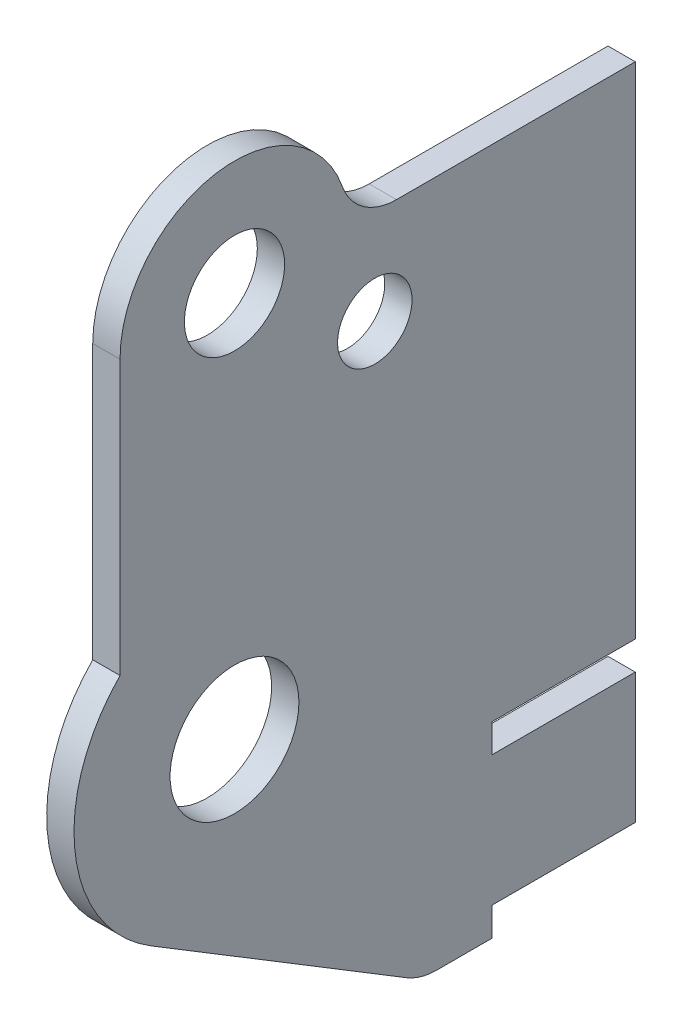
ISO-10303-21;
HEADER;
FILE_DESCRIPTION(('STEP AP214'),'2;1');
FILE_NAME('part.step','',(''),(''),'','','');
FILE_SCHEMA(('AUTOMOTIVE_DESIGN { 1 0 10303 214 1 1 1 1 }'));
ENDSEC;
DATA;
#1=APPLICATION_CONTEXT('core data for automotive mechanical design processes');
#2=APPLICATION_PROTOCOL_DEFINITION('international standard','automotive_design',2000,#1);
#3=PRODUCT_CONTEXT('',#1,'mechanical');
#4=PRODUCT('Part','Part','',(#3));
#5=PRODUCT_RELATED_PRODUCT_CATEGORY('part','',(#4));
#6=PRODUCT_DEFINITION_FORMATION('','',#4);
#7=PRODUCT_DEFINITION_CONTEXT('part definition',#1,'design');
#8=PRODUCT_DEFINITION('design','',#6,#7);
#9=PRODUCT_DEFINITION_SHAPE('','',#8);
#10=(LENGTH_UNIT() NAMED_UNIT(*) SI_UNIT(.MILLI.,.METRE.));
#11=(NAMED_UNIT(*) PLANE_ANGLE_UNIT() SI_UNIT($,.RADIAN.));
#12=(NAMED_UNIT(*) SI_UNIT($,.STERADIAN.) SOLID_ANGLE_UNIT());
#13=UNCERTAINTY_MEASURE_WITH_UNIT(LENGTH_MEASURE(1.E-05),#10,'distance_accuracy_value','');
#14=(GEOMETRIC_REPRESENTATION_CONTEXT(3) GLOBAL_UNCERTAINTY_ASSIGNED_CONTEXT((#13)) GLOBAL_UNIT_ASSIGNED_CONTEXT((#10,
#11,#12)) REPRESENTATION_CONTEXT('',''));
#15=CARTESIAN_POINT('',(0.,0.,0.));
#16=DIRECTION('',(0.,0.,1.));
#17=DIRECTION('',(1.,0.,0.));
#18=AXIS2_PLACEMENT_3D('',#15,#16,#17);
#19=CARTESIAN_POINT('',(-9.53,0.,0.));
#20=DIRECTION('',(1.,0.,0.));
#21=DIRECTION('',(0.,0.,-1.));
#22=AXIS2_PLACEMENT_3D('',#19,#20,#21);
#23=CYLINDRICAL_SURFACE('',#22,40.);
#24=CARTESIAN_POINT('',(0.,0.,0.));
#25=DIRECTION('',(1.,0.,0.));
#26=DIRECTION('',(0.,0.,-1.));
#27=AXIS2_PLACEMENT_3D('',#24,#25,#26);
#28=CIRCLE('',#27,40.);
#29=CARTESIAN_POINT('',(0.,13.3333333333333,-37.7123616632825));
#30=VERTEX_POINT('',#29);
#31=CARTESIAN_POINT('',(0.,0.,40.));
#32=VERTEX_POINT('',#31);
#33=EDGE_CURVE('E180',#30,#32,#28,.T.);
#34=ORIENTED_EDGE('',*,*,#33,.F.);
#35=DIRECTION('',(1.,0.,0.));
#36=VECTOR('',#35,1.);
#37=CARTESIAN_POINT('',(-9.53,13.3333333333333,-37.7123616632825));
#38=LINE('',#37,#36);
#39=CARTESIAN_POINT('',(-9.53,13.3333333333333,-37.7123616632825));
#40=VERTEX_POINT('',#39);
#41=EDGE_CURVE('E11',#40,#30,#38,.T.);
#42=ORIENTED_EDGE('',*,*,#41,.F.);
#43=CARTESIAN_POINT('',(-9.53,0.,0.));
#44=DIRECTION('',(1.,0.,0.));
#45=DIRECTION('',(0.,0.,-1.));
#46=AXIS2_PLACEMENT_3D('',#43,#44,#45);
#47=CIRCLE('',#46,40.);
#48=CARTESIAN_POINT('',(-9.53,0.,40.));
#49=VERTEX_POINT('',#48);
#50=EDGE_CURVE('E222',#40,#49,#47,.T.);
#51=ORIENTED_EDGE('',*,*,#50,.T.);
#52=DIRECTION('',(1.,0.,0.));
#53=VECTOR('',#52,1.);
#54=CARTESIAN_POINT('',(-9.53,0.,40.));
#55=LINE('',#54,#53);
#56=EDGE_CURVE('E44',#49,#32,#55,.T.);
#57=ORIENTED_EDGE('',*,*,#56,.T.);
#58=EDGE_LOOP('',(#34,#42,#51,#57));
#59=FACE_BOUND('',#58,.T.);
#60=ADVANCED_FACE('F41',(#59),#23,.T.);
#61=CARTESIAN_POINT('',(-9.53,20.,-56.5685424949238));
#62=DIRECTION('',(1.,0.,0.));
#63=DIRECTION('',(0.,0.,-1.));
#64=AXIS2_PLACEMENT_3D('',#61,#62,#63);
#65=CYLINDRICAL_SURFACE('',#64,20.);
#66=CARTESIAN_POINT('',(0.,20.,-56.5685424949238));
#67=DIRECTION('',(-1.,0.,0.));
#68=DIRECTION('',(0.,0.,-1.));
#69=AXIS2_PLACEMENT_3D('',#66,#67,#68);
#70=CIRCLE('',#69,20.);
#71=CARTESIAN_POINT('',(0.,0.,-56.5685424949238));
#72=VERTEX_POINT('',#71);
#73=EDGE_CURVE('E220',#72,#30,#70,.T.);
#74=ORIENTED_EDGE('',*,*,#73,.F.);
#75=DIRECTION('',(1.,0.,0.));
#76=VECTOR('',#75,1.);
#77=CARTESIAN_POINT('',(-9.53,0.,-56.5685424949238));
#78=LINE('',#77,#76);
#79=CARTESIAN_POINT('',(-9.53,0.,-56.5685424949238));
#80=VERTEX_POINT('',#79);
#81=EDGE_CURVE('E50',#80,#72,#78,.T.);
#82=ORIENTED_EDGE('',*,*,#81,.F.);
#83=CARTESIAN_POINT('',(-9.53,20.,-56.5685424949238));
#84=DIRECTION('',(-1.,0.,0.));
#85=DIRECTION('',(0.,0.,-1.));
#86=AXIS2_PLACEMENT_3D('',#83,#84,#85);
#87=CIRCLE('',#86,20.);
#88=EDGE_CURVE('E170',#80,#40,#87,.T.);
#89=ORIENTED_EDGE('',*,*,#88,.T.);
#90=ORIENTED_EDGE('',*,*,#41,.T.);
#91=EDGE_LOOP('',(#74,#82,#89,#90));
#92=FACE_BOUND('',#91,.T.);
#93=ADVANCED_FACE('F248',(#92),#65,.F.);
#94=CARTESIAN_POINT('',(-9.53,0.,-56.5685424949238));
#95=DIRECTION('',(0.,1.,0.));
#96=DIRECTION('',(0.,0.,1.));
#97=AXIS2_PLACEMENT_3D('',#94,#95,#96);
#98=PLANE('',#97);
#99=DIRECTION('',(0.,0.,1.));
#100=VECTOR('',#99,1.);
#101=CARTESIAN_POINT('',(0.,0.,-56.5685424949238));
#102=LINE('',#101,#100);
#103=CARTESIAN_POINT('',(0.,0.,-140.));
#104=VERTEX_POINT('',#103);
#105=EDGE_CURVE('E157',#104,#72,#102,.T.);
#106=ORIENTED_EDGE('',*,*,#105,.F.);
#107=DIRECTION('',(1.,0.,0.));
#108=VECTOR('',#107,1.);
#109=CARTESIAN_POINT('',(-9.53,0.,-140.));
#110=LINE('',#109,#108);
#111=CARTESIAN_POINT('',(-9.53,0.,-140.));
#112=VERTEX_POINT('',#111);
#113=EDGE_CURVE('E152',#112,#104,#110,.T.);
#114=ORIENTED_EDGE('',*,*,#113,.F.);
#115=DIRECTION('',(0.,0.,1.));
#116=VECTOR('',#115,1.);
#117=CARTESIAN_POINT('',(-9.53,0.,-56.5685424949238));
#118=LINE('',#117,#116);
#119=EDGE_CURVE('E155',#112,#80,#118,.T.);
#120=ORIENTED_EDGE('',*,*,#119,.T.);
#121=ORIENTED_EDGE('',*,*,#81,.T.);
#122=EDGE_LOOP('',(#106,#114,#120,#121));
#123=FACE_BOUND('',#122,.T.);
#124=ADVANCED_FACE('F154',(#123),#98,.T.);
#125=CARTESIAN_POINT('',(-9.53,0.,-140.));
#126=DIRECTION('',(0.,0.,-1.));
#127=DIRECTION('',(0.,1.,0.));
#128=AXIS2_PLACEMENT_3D('',#125,#126,#127);
#129=PLANE('',#128);
#130=DIRECTION('',(0.,1.,0.));
#131=VECTOR('',#130,1.);
#132=CARTESIAN_POINT('',(0.,0.,-140.));
#133=LINE('',#132,#131);
#134=CARTESIAN_POINT('',(0.,-174.65,-140.));
#135=VERTEX_POINT('',#134);
#136=EDGE_CURVE('E217',#135,#104,#133,.T.);
#137=ORIENTED_EDGE('',*,*,#136,.F.);
#138=DIRECTION('',(1.,0.,0.));
#139=VECTOR('',#138,1.);
#140=CARTESIAN_POINT('',(-9.53,-174.65,-140.));
#141=LINE('',#140,#139);
#142=CARTESIAN_POINT('',(-9.53,-174.65,-140.));
#143=VERTEX_POINT('',#142);
#144=EDGE_CURVE('E162',#143,#135,#141,.T.);
#145=ORIENTED_EDGE('',*,*,#144,.F.);
#146=DIRECTION('',(0.,1.,0.));
#147=VECTOR('',#146,1.);
#148=CARTESIAN_POINT('',(-9.53,0.,-140.));
#149=LINE('',#148,#147);
#150=EDGE_CURVE('E168',#143,#112,#149,.T.);
#151=ORIENTED_EDGE('',*,*,#150,.T.);
#152=ORIENTED_EDGE('',*,*,#113,.T.);
#153=EDGE_LOOP('',(#137,#145,#151,#152));
#154=FACE_BOUND('',#153,.T.);
#155=ADVANCED_FACE('F172',(#154),#129,.T.);
#156=CARTESIAN_POINT('',(-9.53,-174.65,-140.));
#157=DIRECTION('',(0.,-1.,0.));
#158=DIRECTION('',(0.,0.,-1.));
#159=AXIS2_PLACEMENT_3D('',#156,#157,#158);
#160=PLANE('',#159);
#161=DIRECTION('',(0.,0.,-1.));
#162=VECTOR('',#161,1.);
#163=CARTESIAN_POINT('',(0.,-174.65,-140.));
#164=LINE('',#163,#162);
#165=CARTESIAN_POINT('',(0.,-174.65,-90.0000000000001));
#166=VERTEX_POINT('',#165);
#167=EDGE_CURVE('E214',#166,#135,#164,.T.);
#168=ORIENTED_EDGE('',*,*,#167,.F.);
#169=DIRECTION('',(1.,0.,0.));
#170=VECTOR('',#169,1.);
#171=CARTESIAN_POINT('',(-9.53,-174.65,-90.0000000000001));
#172=LINE('',#171,#170);
#173=CARTESIAN_POINT('',(-9.53,-174.65,-90.0000000000001));
#174=VERTEX_POINT('',#173);
#175=EDGE_CURVE('E226',#174,#166,#172,.T.);
#176=ORIENTED_EDGE('',*,*,#175,.F.);
#177=DIRECTION('',(0.,0.,-1.));
#178=VECTOR('',#177,1.);
#179=CARTESIAN_POINT('',(-9.53,-174.65,-140.));
#180=LINE('',#179,#178);
#181=EDGE_CURVE('E173',#174,#143,#180,.T.);
#182=ORIENTED_EDGE('',*,*,#181,.T.);
#183=ORIENTED_EDGE('',*,*,#144,.T.);
#184=EDGE_LOOP('',(#168,#176,#182,#183));
#185=FACE_BOUND('',#184,.T.);
#186=ADVANCED_FACE('F261',(#185),#160,.T.);
#187=CARTESIAN_POINT('',(-9.53,-174.65,-90.0000000000001));
#188=DIRECTION('',(0.,0.,-1.));
#189=DIRECTION('',(-1.,0.,0.));
#190=AXIS2_PLACEMENT_3D('',#187,#188,#189);
#191=PLANE('',#190);
#192=DIRECTION('',(0.,1.,0.));
#193=VECTOR('',#192,1.);
#194=CARTESIAN_POINT('',(0.,-174.65,-90.0000000000001));
#195=LINE('',#194,#193);
#196=CARTESIAN_POINT('',(0.,-184.65,-90.0000000000001));
#197=VERTEX_POINT('',#196);
#198=EDGE_CURVE('E211',#197,#166,#195,.T.);
#199=ORIENTED_EDGE('',*,*,#198,.F.);
#200=DIRECTION('',(1.,0.,0.));
#201=VECTOR('',#200,1.);
#202=CARTESIAN_POINT('',(-9.53,-184.65,-90.0000000000001));
#203=LINE('',#202,#201);
#204=CARTESIAN_POINT('',(-9.53,-184.65,-90.0000000000001));
#205=VERTEX_POINT('',#204);
#206=EDGE_CURVE('E228',#205,#197,#203,.T.);
#207=ORIENTED_EDGE('',*,*,#206,.F.);
#208=DIRECTION('',(0.,1.,0.));
#209=VECTOR('',#208,1.);
#210=CARTESIAN_POINT('',(-9.53,-174.65,-90.0000000000001));
#211=LINE('',#210,#209);
#212=EDGE_CURVE('E175',#205,#174,#211,.T.);
#213=ORIENTED_EDGE('',*,*,#212,.T.);
#214=ORIENTED_EDGE('',*,*,#175,.T.);
#215=EDGE_LOOP('',(#199,#207,#213,#214));
#216=FACE_BOUND('',#215,.T.);
#217=ADVANCED_FACE('F264',(#216),#191,.T.);
#218=CARTESIAN_POINT('',(-9.53,-184.65,-90.0000000000001));
#219=DIRECTION('',(0.,1.,0.));
#220=DIRECTION('',(0.,0.,1.));
#221=AXIS2_PLACEMENT_3D('',#218,#219,#220);
#222=PLANE('',#221);
#223=DIRECTION('',(0.,0.,1.));
#224=VECTOR('',#223,1.);
#225=CARTESIAN_POINT('',(0.,-184.65,-90.0000000000001));
#226=LINE('',#225,#224);
#227=CARTESIAN_POINT('',(0.,-184.65,-140.));
#228=VERTEX_POINT('',#227);
#229=EDGE_CURVE('E208',#228,#197,#226,.T.);
#230=ORIENTED_EDGE('',*,*,#229,.F.);
#231=DIRECTION('',(1.,0.,0.));
#232=VECTOR('',#231,1.);
#233=CARTESIAN_POINT('',(-9.53,-184.65,-140.));
#234=LINE('',#233,#232);
#235=CARTESIAN_POINT('',(-9.53,-184.65,-140.));
#236=VERTEX_POINT('',#235);
#237=EDGE_CURVE('E230',#236,#228,#234,.T.);
#238=ORIENTED_EDGE('',*,*,#237,.F.);
#239=DIRECTION('',(0.,0.,1.));
#240=VECTOR('',#239,1.);
#241=CARTESIAN_POINT('',(-9.53,-184.65,-90.0000000000001));
#242=LINE('',#241,#240);
#243=EDGE_CURVE('E369',#236,#205,#242,.T.);
#244=ORIENTED_EDGE('',*,*,#243,.T.);
#245=ORIENTED_EDGE('',*,*,#206,.T.);
#246=EDGE_LOOP('',(#230,#238,#244,#245));
#247=FACE_BOUND('',#246,.T.);
#248=ADVANCED_FACE('F268',(#247),#222,.T.);
#249=CARTESIAN_POINT('',(-9.53,-184.65,-140.));
#250=DIRECTION('',(0.,0.,-1.));
#251=DIRECTION('',(-1.,0.,0.));
#252=AXIS2_PLACEMENT_3D('',#249,#250,#251);
#253=PLANE('',#252);
#254=DIRECTION('',(0.,1.,0.));
#255=VECTOR('',#254,1.);
#256=CARTESIAN_POINT('',(0.,-184.65,-140.));
#257=LINE('',#256,#255);
#258=CARTESIAN_POINT('',(0.,-230.15,-140.));
#259=VERTEX_POINT('',#258);
#260=EDGE_CURVE('E205',#259,#228,#257,.T.);
#261=ORIENTED_EDGE('',*,*,#260,.F.);
#262=DIRECTION('',(1.,0.,0.));
#263=VECTOR('',#262,1.);
#264=CARTESIAN_POINT('',(-9.53,-230.15,-140.));
#265=LINE('',#264,#263);
#266=CARTESIAN_POINT('',(-9.53,-230.15,-140.));
#267=VERTEX_POINT('',#266);
#268=EDGE_CURVE('E232',#267,#259,#265,.T.);
#269=ORIENTED_EDGE('',*,*,#268,.F.);
#270=DIRECTION('',(0.,1.,0.));
#271=VECTOR('',#270,1.);
#272=CARTESIAN_POINT('',(-9.53,-184.65,-140.));
#273=LINE('',#272,#271);
#274=EDGE_CURVE('E366',#267,#236,#273,.T.);
#275=ORIENTED_EDGE('',*,*,#274,.T.);
#276=ORIENTED_EDGE('',*,*,#237,.T.);
#277=EDGE_LOOP('',(#261,#269,#275,#276));
#278=FACE_BOUND('',#277,.T.);
#279=ADVANCED_FACE('F272',(#278),#253,.T.);
#280=CARTESIAN_POINT('',(-9.53,-230.15,-140.));
#281=DIRECTION('',(0.,-1.,0.));
#282=DIRECTION('',(0.,0.,-1.));
#283=AXIS2_PLACEMENT_3D('',#280,#281,#282);
#284=PLANE('',#283);
#285=DIRECTION('',(0.,0.,-1.));
#286=VECTOR('',#285,1.);
#287=CARTESIAN_POINT('',(0.,-230.15,-140.));
#288=LINE('',#287,#286);
#289=CARTESIAN_POINT('',(0.,-230.15,-90.0000000000001));
#290=VERTEX_POINT('',#289);
#291=EDGE_CURVE('E202',#290,#259,#288,.T.);
#292=ORIENTED_EDGE('',*,*,#291,.F.);
#293=DIRECTION('',(1.,0.,0.));
#294=VECTOR('',#293,1.);
#295=CARTESIAN_POINT('',(-9.53,-230.15,-90.0000000000001));
#296=LINE('',#295,#294);
#297=CARTESIAN_POINT('',(-9.53,-230.15,-90.0000000000001));
#298=VERTEX_POINT('',#297);
#299=EDGE_CURVE('E234',#298,#290,#296,.T.);
#300=ORIENTED_EDGE('',*,*,#299,.F.);
#301=DIRECTION('',(0.,0.,-1.));
#302=VECTOR('',#301,1.);
#303=CARTESIAN_POINT('',(-9.53,-230.15,-140.));
#304=LINE('',#303,#302);
#305=EDGE_CURVE('E363',#298,#267,#304,.T.);
#306=ORIENTED_EDGE('',*,*,#305,.T.);
#307=ORIENTED_EDGE('',*,*,#268,.T.);
#308=EDGE_LOOP('',(#292,#300,#306,#307));
#309=FACE_BOUND('',#308,.T.);
#310=ADVANCED_FACE('F276',(#309),#284,.T.);
#311=CARTESIAN_POINT('',(-9.53,-230.15,-90.0000000000001));
#312=DIRECTION('',(0.,0.,-1.));
#313=DIRECTION('',(-1.,0.,0.));
#314=AXIS2_PLACEMENT_3D('',#311,#312,#313);
#315=PLANE('',#314);
#316=DIRECTION('',(0.,1.,0.));
#317=VECTOR('',#316,1.);
#318=CARTESIAN_POINT('',(0.,-230.15,-90.0000000000001));
#319=LINE('',#318,#317);
#320=CARTESIAN_POINT('',(0.,-240.15,-90.0000000000001));
#321=VERTEX_POINT('',#320);
#322=EDGE_CURVE('E199',#321,#290,#319,.T.);
#323=ORIENTED_EDGE('',*,*,#322,.F.);
#324=DIRECTION('',(1.,0.,0.));
#325=VECTOR('',#324,1.);
#326=CARTESIAN_POINT('',(-9.53,-240.15,-90.0000000000001));
#327=LINE('',#326,#325);
#328=CARTESIAN_POINT('',(-9.53,-240.15,-90.0000000000001));
#329=VERTEX_POINT('',#328);
#330=EDGE_CURVE('E236',#329,#321,#327,.T.);
#331=ORIENTED_EDGE('',*,*,#330,.F.);
#332=DIRECTION('',(0.,1.,0.));
#333=VECTOR('',#332,1.);
#334=CARTESIAN_POINT('',(-9.53,-230.15,-90.0000000000001));
#335=LINE('',#334,#333);
#336=EDGE_CURVE('E360',#329,#298,#335,.T.);
#337=ORIENTED_EDGE('',*,*,#336,.T.);
#338=ORIENTED_EDGE('',*,*,#299,.T.);
#339=EDGE_LOOP('',(#323,#331,#337,#338));
#340=FACE_BOUND('',#339,.T.);
#341=ADVANCED_FACE('F280',(#340),#315,.T.);
#342=CARTESIAN_POINT('',(-9.53,-240.15,-90.0000000000001));
#343=DIRECTION('',(0.,-1.,0.));
#344=DIRECTION('',(0.,0.,-1.));
#345=AXIS2_PLACEMENT_3D('',#342,#343,#344);
#346=PLANE('',#345);
#347=DIRECTION('',(0.,0.,-1.));
#348=VECTOR('',#347,1.);
#349=CARTESIAN_POINT('',(0.,-240.15,-90.0000000000001));
#350=LINE('',#349,#348);
#351=CARTESIAN_POINT('',(0.,-240.15,-70.6026842123474));
#352=VERTEX_POINT('',#351);
#353=EDGE_CURVE('E196',#352,#321,#350,.T.);
#354=ORIENTED_EDGE('',*,*,#353,.F.);
#355=DIRECTION('',(1.,0.,0.));
#356=VECTOR('',#355,1.);
#357=CARTESIAN_POINT('',(-9.53,-240.15,-70.6026842123474));
#358=LINE('',#357,#356);
#359=CARTESIAN_POINT('',(-9.53,-240.15,-70.6026842123474));
#360=VERTEX_POINT('',#359);
#361=EDGE_CURVE('E238',#360,#352,#358,.T.);
#362=ORIENTED_EDGE('',*,*,#361,.F.);
#363=DIRECTION('',(0.,0.,-1.));
#364=VECTOR('',#363,1.);
#365=CARTESIAN_POINT('',(-9.53,-240.15,-90.0000000000001));
#366=LINE('',#365,#364);
#367=EDGE_CURVE('E357',#360,#329,#366,.T.);
#368=ORIENTED_EDGE('',*,*,#367,.T.);
#369=ORIENTED_EDGE('',*,*,#330,.T.);
#370=EDGE_LOOP('',(#354,#362,#368,#369));
#371=FACE_BOUND('',#370,.T.);
#372=ADVANCED_FACE('F284',(#371),#346,.T.);
#373=CARTESIAN_POINT('',(-9.53,-220.15,-70.6026842123473));
#374=DIRECTION('',(1.,0.,0.));
#375=DIRECTION('',(0.,0.,-1.));
#376=AXIS2_PLACEMENT_3D('',#373,#374,#375);
#377=CYLINDRICAL_SURFACE('',#376,20.);
#378=CARTESIAN_POINT('',(0.,-220.15,-70.6026842123473));
#379=DIRECTION('',(1.,0.,0.));
#380=DIRECTION('',(0.,0.,1.));
#381=AXIS2_PLACEMENT_3D('',#378,#379,#380);
#382=CIRCLE('',#381,20.);
#383=CARTESIAN_POINT('',(0.,-237.239402604432,-60.2126736914851));
#384=VERTEX_POINT('',#383);
#385=EDGE_CURVE('E193',#384,#352,#382,.T.);
#386=ORIENTED_EDGE('',*,*,#385,.F.);
#387=DIRECTION('',(1.,0.,0.));
#388=VECTOR('',#387,1.);
#389=CARTESIAN_POINT('',(-9.53,-237.239402604432,-60.2126736914851));
#390=LINE('',#389,#388);
#391=CARTESIAN_POINT('',(-9.53,-237.239402604432,-60.2126736914851));
#392=VERTEX_POINT('',#391);
#393=EDGE_CURVE('E240',#392,#384,#390,.T.);
#394=ORIENTED_EDGE('',*,*,#393,.F.);
#395=CARTESIAN_POINT('',(-9.53,-220.15,-70.6026842123473));
#396=DIRECTION('',(1.,0.,0.));
#397=DIRECTION('',(0.,0.,1.));
#398=AXIS2_PLACEMENT_3D('',#395,#396,#397);
#399=CIRCLE('',#398,20.);
#400=EDGE_CURVE('E354',#392,#360,#399,.T.);
#401=ORIENTED_EDGE('',*,*,#400,.T.);
#402=ORIENTED_EDGE('',*,*,#361,.T.);
#403=EDGE_LOOP('',(#386,#394,#401,#402));
#404=FACE_BOUND('',#403,.T.);
#405=ADVANCED_FACE('F288',(#404),#377,.T.);
#406=CARTESIAN_POINT('',(-9.53,-237.239402604432,-60.2126736914851));
#407=DIRECTION('',(0.,-0.854470130221608,0.51950052604311));
#408=DIRECTION('',(0.,-0.51950052604311,-0.854470130221608));
#409=AXIS2_PLACEMENT_3D('',#406,#407,#408);
#410=PLANE('',#409);
#411=DIRECTION('',(0.,-0.51950052604311,-0.854470130221608));
#412=VECTOR('',#411,1.);
#413=CARTESIAN_POINT('',(0.,-237.239402604432,-60.2126736914851));
#414=LINE('',#413,#412);
#415=CARTESIAN_POINT('',(0.,-182.918684902828,29.1335895004976));
#416=VERTEX_POINT('',#415);
#417=EDGE_CURVE('E190',#416,#384,#414,.T.);
#418=ORIENTED_EDGE('',*,*,#417,.F.);
#419=DIRECTION('',(1.,0.,0.));
#420=VECTOR('',#419,1.);
#421=CARTESIAN_POINT('',(-9.53,-182.918684902828,29.1335895004976));
#422=LINE('',#421,#420);
#423=CARTESIAN_POINT('',(-9.53,-182.918684902828,29.1335895004976));
#424=VERTEX_POINT('',#423);
#425=EDGE_CURVE('E242',#424,#416,#422,.T.);
#426=ORIENTED_EDGE('',*,*,#425,.F.);
#427=DIRECTION('',(0.,-0.51950052604311,-0.854470130221608));
#428=VECTOR('',#427,1.);
#429=CARTESIAN_POINT('',(-9.53,-237.239402604432,-60.2126736914851));
#430=LINE('',#429,#428);
#431=EDGE_CURVE('E351',#424,#392,#430,.T.);
#432=ORIENTED_EDGE('',*,*,#431,.T.);
#433=ORIENTED_EDGE('',*,*,#393,.T.);
#434=EDGE_LOOP('',(#418,#426,#432,#433));
#435=FACE_BOUND('',#434,.T.);
#436=ADVANCED_FACE('F292',(#435),#410,.T.);
#437=CARTESIAN_POINT('',(-9.53,-135.,0.));
#438=DIRECTION('',(1.,0.,0.));
#439=DIRECTION('',(0.,0.,-1.));
#440=AXIS2_PLACEMENT_3D('',#437,#438,#439);
#441=CYLINDRICAL_SURFACE('',#440,56.08);
#442=CARTESIAN_POINT('',(0.,-135.,0.));
#443=DIRECTION('',(1.,0.,0.));
#444=DIRECTION('',(0.,0.,-1.));
#445=AXIS2_PLACEMENT_3D('',#442,#443,#444);
#446=CIRCLE('',#445,56.08);
#447=CARTESIAN_POINT('',(0.,-95.6939393986118,40.));
#448=VERTEX_POINT('',#447);
#449=EDGE_CURVE('E187',#448,#416,#446,.T.);
#450=ORIENTED_EDGE('',*,*,#449,.F.);
#451=DIRECTION('',(1.,0.,0.));
#452=VECTOR('',#451,1.);
#453=CARTESIAN_POINT('',(-9.53,-95.6939393986118,40.));
#454=LINE('',#453,#452);
#455=CARTESIAN_POINT('',(-9.53,-95.6939393986118,40.));
#456=VERTEX_POINT('',#455);
#457=EDGE_CURVE('E243',#456,#448,#454,.T.);
#458=ORIENTED_EDGE('',*,*,#457,.F.);
#459=CARTESIAN_POINT('',(-9.53,-135.,0.));
#460=DIRECTION('',(1.,0.,0.));
#461=DIRECTION('',(0.,0.,-1.));
#462=AXIS2_PLACEMENT_3D('',#459,#460,#461);
#463=CIRCLE('',#462,56.08);
#464=EDGE_CURVE('E348',#456,#424,#463,.T.);
#465=ORIENTED_EDGE('',*,*,#464,.T.);
#466=ORIENTED_EDGE('',*,*,#425,.T.);
#467=EDGE_LOOP('',(#450,#458,#465,#466));
#468=FACE_BOUND('',#467,.T.);
#469=ADVANCED_FACE('F296',(#468),#441,.T.);
#470=CARTESIAN_POINT('',(-9.53,0.,40.));
#471=DIRECTION('',(0.,0.,1.));
#472=DIRECTION('',(1.,0.,0.));
#473=AXIS2_PLACEMENT_3D('',#470,#471,#472);
#474=PLANE('',#473);
#475=DIRECTION('',(0.,-1.,0.));
#476=VECTOR('',#475,1.);
#477=CARTESIAN_POINT('',(0.,0.,40.));
#478=LINE('',#477,#476);
#479=EDGE_CURVE('E183',#32,#448,#478,.T.);
#480=ORIENTED_EDGE('',*,*,#479,.F.);
#481=ORIENTED_EDGE('',*,*,#56,.F.);
#482=DIRECTION('',(0.,-1.,0.));
#483=VECTOR('',#482,1.);
#484=CARTESIAN_POINT('',(-9.53,0.,40.));
#485=LINE('',#484,#483);
#486=EDGE_CURVE('E346',#49,#456,#485,.T.);
#487=ORIENTED_EDGE('',*,*,#486,.T.);
#488=ORIENTED_EDGE('',*,*,#457,.T.);
#489=EDGE_LOOP('',(#480,#481,#487,#488));
#490=FACE_BOUND('',#489,.T.);
#491=ADVANCED_FACE('F245',(#490),#474,.T.);
#492=CARTESIAN_POINT('',(-9.53,0.,0.));
#493=DIRECTION('',(1.,0.,0.));
#494=DIRECTION('',(0.,0.,-1.));
#495=AXIS2_PLACEMENT_3D('',#492,#493,#494);
#496=PLANE('',#495);
#497=CARTESIAN_POINT('',(-9.53,-33.,-49.01));
#498=DIRECTION('',(1.,0.,0.));
#499=DIRECTION('',(0.,0.,-1.));
#500=AXIS2_PLACEMENT_3D('',#497,#498,#499);
#501=CIRCLE('',#500,13.);
#502=CARTESIAN_POINT('',(-9.53,-33.,-62.01));
#503=VERTEX_POINT('',#502);
#504=EDGE_CURVE('E327',#503,#503,#501,.T.);
#505=ORIENTED_EDGE('',*,*,#504,.T.);
#506=EDGE_LOOP('',(#505));
#507=FACE_BOUND('',#506,.T.);
#508=CARTESIAN_POINT('',(-9.53,-135.,0.));
#509=DIRECTION('',(1.,0.,0.));
#510=DIRECTION('',(0.,0.,-1.));
#511=AXIS2_PLACEMENT_3D('',#508,#509,#510);
#512=CIRCLE('',#511,22.5);
#513=CARTESIAN_POINT('',(-9.53,-135.,-22.5));
#514=VERTEX_POINT('',#513);
#515=EDGE_CURVE('E335',#514,#514,#512,.T.);
#516=ORIENTED_EDGE('',*,*,#515,.T.);
#517=EDGE_LOOP('',(#516));
#518=FACE_BOUND('',#517,.T.);
#519=CARTESIAN_POINT('',(-9.53,0.,0.));
#520=DIRECTION('',(1.,0.,0.));
#521=DIRECTION('',(0.,0.,-1.));
#522=AXIS2_PLACEMENT_3D('',#519,#520,#521);
#523=CIRCLE('',#522,17.5);
#524=CARTESIAN_POINT('',(-9.53,0.,-17.5));
#525=VERTEX_POINT('',#524);
#526=EDGE_CURVE('E184',#525,#525,#523,.T.);
#527=ORIENTED_EDGE('',*,*,#526,.T.);
#528=EDGE_LOOP('',(#527));
#529=FACE_BOUND('',#528,.T.);
#530=ORIENTED_EDGE('',*,*,#50,.F.);
#531=ORIENTED_EDGE('',*,*,#88,.F.);
#532=ORIENTED_EDGE('',*,*,#119,.F.);
#533=ORIENTED_EDGE('',*,*,#150,.F.);
#534=ORIENTED_EDGE('',*,*,#181,.F.);
#535=ORIENTED_EDGE('',*,*,#212,.F.);
#536=ORIENTED_EDGE('',*,*,#243,.F.);
#537=ORIENTED_EDGE('',*,*,#274,.F.);
#538=ORIENTED_EDGE('',*,*,#305,.F.);
#539=ORIENTED_EDGE('',*,*,#336,.F.);
#540=ORIENTED_EDGE('',*,*,#367,.F.);
#541=ORIENTED_EDGE('',*,*,#400,.F.);
#542=ORIENTED_EDGE('',*,*,#431,.F.);
#543=ORIENTED_EDGE('',*,*,#464,.F.);
#544=ORIENTED_EDGE('',*,*,#486,.F.);
#545=EDGE_LOOP('',(#530,#531,#532,#533,#534,#535,#536,#537,#538,#539,#540,#541,#542,#543,#544));
#546=FACE_BOUND('',#545,.T.);
#547=ADVANCED_FACE('F166',(#507,#518,#529,#546),#496,.F.);
#548=CARTESIAN_POINT('',(0.,0.,0.));
#549=DIRECTION('',(1.,0.,0.));
#550=DIRECTION('',(0.,0.,-1.));
#551=AXIS2_PLACEMENT_3D('',#548,#549,#550);
#552=PLANE('',#551);
#553=CARTESIAN_POINT('',(0.,-33.,-49.01));
#554=DIRECTION('',(1.,0.,0.));
#555=DIRECTION('',(0.,0.,-1.));
#556=AXIS2_PLACEMENT_3D('',#553,#554,#555);
#557=CIRCLE('',#556,13.);
#558=CARTESIAN_POINT('',(0.,-33.,-62.01));
#559=VERTEX_POINT('',#558);
#560=EDGE_CURVE('E330',#559,#559,#557,.T.);
#561=ORIENTED_EDGE('',*,*,#560,.F.);
#562=EDGE_LOOP('',(#561));
#563=FACE_BOUND('',#562,.T.);
#564=CARTESIAN_POINT('',(0.,-135.,0.));
#565=DIRECTION('',(1.,0.,0.));
#566=DIRECTION('',(0.,0.,-1.));
#567=AXIS2_PLACEMENT_3D('',#564,#565,#566);
#568=CIRCLE('',#567,22.5);
#569=CARTESIAN_POINT('',(0.,-135.,-22.5));
#570=VERTEX_POINT('',#569);
#571=EDGE_CURVE('E332',#570,#570,#568,.T.);
#572=ORIENTED_EDGE('',*,*,#571,.F.);
#573=EDGE_LOOP('',(#572));
#574=FACE_BOUND('',#573,.T.);
#575=CARTESIAN_POINT('',(0.,0.,0.));
#576=DIRECTION('',(1.,0.,0.));
#577=DIRECTION('',(0.,0.,-1.));
#578=AXIS2_PLACEMENT_3D('',#575,#576,#577);
#579=CIRCLE('',#578,17.5);
#580=CARTESIAN_POINT('',(0.,0.,-17.5));
#581=VERTEX_POINT('',#580);
#582=EDGE_CURVE('E338',#581,#581,#579,.T.);
#583=ORIENTED_EDGE('',*,*,#582,.F.);
#584=EDGE_LOOP('',(#583));
#585=FACE_BOUND('',#584,.T.);
#586=ORIENTED_EDGE('',*,*,#33,.T.);
#587=ORIENTED_EDGE('',*,*,#479,.T.);
#588=ORIENTED_EDGE('',*,*,#449,.T.);
#589=ORIENTED_EDGE('',*,*,#417,.T.);
#590=ORIENTED_EDGE('',*,*,#385,.T.);
#591=ORIENTED_EDGE('',*,*,#353,.T.);
#592=ORIENTED_EDGE('',*,*,#322,.T.);
#593=ORIENTED_EDGE('',*,*,#291,.T.);
#594=ORIENTED_EDGE('',*,*,#260,.T.);
#595=ORIENTED_EDGE('',*,*,#229,.T.);
#596=ORIENTED_EDGE('',*,*,#198,.T.);
#597=ORIENTED_EDGE('',*,*,#167,.T.);
#598=ORIENTED_EDGE('',*,*,#136,.T.);
#599=ORIENTED_EDGE('',*,*,#105,.T.);
#600=ORIENTED_EDGE('',*,*,#73,.T.);
#601=EDGE_LOOP('',(#586,#587,#588,#589,#590,#591,#592,#593,#594,#595,#596,#597,#598,#599,#600));
#602=FACE_BOUND('',#601,.T.);
#603=ADVANCED_FACE('F247',(#563,#574,#585,#602),#552,.T.);
#604=CARTESIAN_POINT('',(-9.53,0.,0.));
#605=DIRECTION('',(1.,0.,0.));
#606=DIRECTION('',(0.,0.,-1.));
#607=AXIS2_PLACEMENT_3D('',#604,#605,#606);
#608=CYLINDRICAL_SURFACE('',#607,17.5);
#609=ORIENTED_EDGE('',*,*,#526,.F.);
#610=EDGE_LOOP('',(#609));
#611=FACE_BOUND('',#610,.T.);
#612=ORIENTED_EDGE('',*,*,#582,.T.);
#613=EDGE_LOOP('',(#612));
#614=FACE_BOUND('',#613,.T.);
#615=ADVANCED_FACE('F308',(#611,#614),#608,.F.);
#616=CARTESIAN_POINT('',(-9.53,-135.,0.));
#617=DIRECTION('',(1.,0.,0.));
#618=DIRECTION('',(0.,0.,-1.));
#619=AXIS2_PLACEMENT_3D('',#616,#617,#618);
#620=CYLINDRICAL_SURFACE('',#619,22.5);
#621=ORIENTED_EDGE('',*,*,#515,.F.);
#622=EDGE_LOOP('',(#621));
#623=FACE_BOUND('',#622,.T.);
#624=ORIENTED_EDGE('',*,*,#571,.T.);
#625=EDGE_LOOP('',(#624));
#626=FACE_BOUND('',#625,.T.);
#627=ADVANCED_FACE('F315',(#623,#626),#620,.F.);
#628=CARTESIAN_POINT('',(-9.53,-33.,-49.01));
#629=DIRECTION('',(1.,0.,0.));
#630=DIRECTION('',(0.,0.,-1.));
#631=AXIS2_PLACEMENT_3D('',#628,#629,#630);
#632=CYLINDRICAL_SURFACE('',#631,13.);
#633=ORIENTED_EDGE('',*,*,#504,.F.);
#634=EDGE_LOOP('',(#633));
#635=FACE_BOUND('',#634,.T.);
#636=ORIENTED_EDGE('',*,*,#560,.T.);
#637=EDGE_LOOP('',(#636));
#638=FACE_BOUND('',#637,.T.);
#639=ADVANCED_FACE('F319',(#635,#638),#632,.F.);
#640=CLOSED_SHELL('',(#60,#93,#124,#155,#186,#217,#248,#279,#310,#341,#372,#405,#436,#469,#491,
#547,#603,#615,#627,#639));
#641=MANIFOLD_SOLID_BREP('B2',#640);
#642=ADVANCED_BREP_SHAPE_REPRESENTATION('',(#18,#641),#14);
#643=SHAPE_DEFINITION_REPRESENTATION(#9,#642);
ENDSEC;
END-ISO-10303-21;
